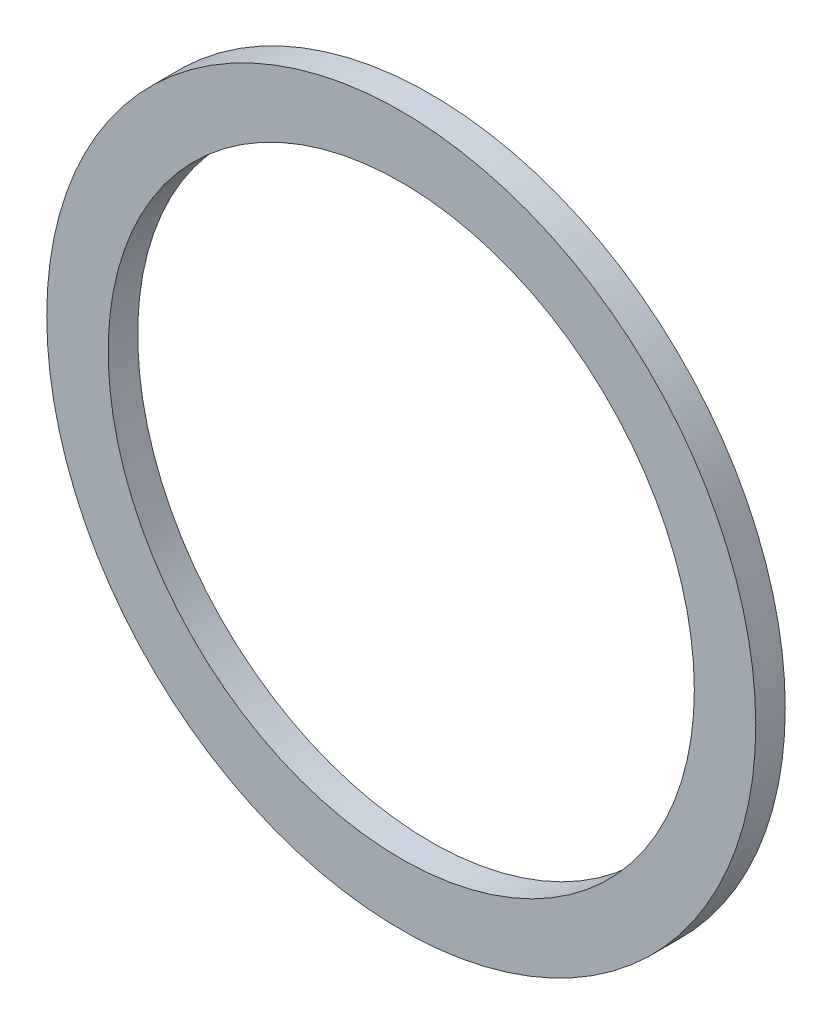
ISO-10303-21;
HEADER;
FILE_DESCRIPTION(('STEP AP214'),'2;1');
FILE_NAME('part.step','',(''),(''),'','','');
FILE_SCHEMA(('AUTOMOTIVE_DESIGN { 1 0 10303 214 1 1 1 1 }'));
ENDSEC;
DATA;
#1=APPLICATION_CONTEXT('core data for automotive mechanical design processes');
#2=APPLICATION_PROTOCOL_DEFINITION('international standard','automotive_design',2000,#1);
#3=PRODUCT_CONTEXT('',#1,'mechanical');
#4=PRODUCT('Part','Part','',(#3));
#5=PRODUCT_RELATED_PRODUCT_CATEGORY('part','',(#4));
#6=PRODUCT_DEFINITION_FORMATION('','',#4);
#7=PRODUCT_DEFINITION_CONTEXT('part definition',#1,'design');
#8=PRODUCT_DEFINITION('design','',#6,#7);
#9=PRODUCT_DEFINITION_SHAPE('','',#8);
#10=(LENGTH_UNIT() NAMED_UNIT(*) SI_UNIT(.MILLI.,.METRE.));
#11=(NAMED_UNIT(*) PLANE_ANGLE_UNIT() SI_UNIT($,.RADIAN.));
#12=(NAMED_UNIT(*) SI_UNIT($,.STERADIAN.) SOLID_ANGLE_UNIT());
#13=UNCERTAINTY_MEASURE_WITH_UNIT(LENGTH_MEASURE(1.E-05),#10,'distance_accuracy_value','');
#14=(GEOMETRIC_REPRESENTATION_CONTEXT(3) GLOBAL_UNCERTAINTY_ASSIGNED_CONTEXT((#13)) GLOBAL_UNIT_ASSIGNED_CONTEXT((#10,
#11,#12)) REPRESENTATION_CONTEXT('',''));
#15=CARTESIAN_POINT('',(0.,0.,0.));
#16=DIRECTION('',(0.,0.,1.));
#17=DIRECTION('',(1.,0.,0.));
#18=AXIS2_PLACEMENT_3D('',#15,#16,#17);
#19=CARTESIAN_POINT('',(0.,0.,3.048));
#20=DIRECTION('',(0.,0.,1.));
#21=DIRECTION('',(1.,0.,0.));
#22=AXIS2_PLACEMENT_3D('',#19,#20,#21);
#23=CYLINDRICAL_SURFACE('',#22,36.6395);
#24=CARTESIAN_POINT('',(0.,0.,3.048));
#25=DIRECTION('',(0.,0.,1.));
#26=DIRECTION('',(1.,0.,0.));
#27=AXIS2_PLACEMENT_3D('',#24,#25,#26);
#28=CIRCLE('',#27,36.6395);
#29=CARTESIAN_POINT('',(36.6395,0.,3.048));
#30=VERTEX_POINT('',#29);
#31=EDGE_CURVE('E60',#30,#30,#28,.T.);
#32=ORIENTED_EDGE('',*,*,#31,.F.);
#33=EDGE_LOOP('',(#32));
#34=FACE_BOUND('',#33,.T.);
#35=CARTESIAN_POINT('',(0.,0.,0.));
#36=DIRECTION('',(0.,0.,1.));
#37=DIRECTION('',(1.,0.,0.));
#38=AXIS2_PLACEMENT_3D('',#35,#36,#37);
#39=CIRCLE('',#38,36.6395);
#40=CARTESIAN_POINT('',(36.6395,0.,0.));
#41=VERTEX_POINT('',#40);
#42=EDGE_CURVE('E68',#41,#41,#39,.T.);
#43=ORIENTED_EDGE('',*,*,#42,.T.);
#44=EDGE_LOOP('',(#43));
#45=FACE_BOUND('',#44,.T.);
#46=ADVANCED_FACE('F51',(#34,#45),#23,.T.);
#47=CARTESIAN_POINT('',(0.,0.,3.048));
#48=DIRECTION('',(0.,0.,1.));
#49=DIRECTION('',(1.,0.,0.));
#50=AXIS2_PLACEMENT_3D('',#47,#48,#49);
#51=CYLINDRICAL_SURFACE('',#50,30.2895);
#52=CARTESIAN_POINT('',(0.,0.,3.048));
#53=DIRECTION('',(0.,0.,1.));
#54=DIRECTION('',(1.,0.,0.));
#55=AXIS2_PLACEMENT_3D('',#52,#53,#54);
#56=CIRCLE('',#55,30.2895);
#57=CARTESIAN_POINT('',(30.2895,0.,3.048));
#58=VERTEX_POINT('',#57);
#59=EDGE_CURVE('E11',#58,#58,#56,.T.);
#60=ORIENTED_EDGE('',*,*,#59,.T.);
#61=EDGE_LOOP('',(#60));
#62=FACE_BOUND('',#61,.T.);
#63=CARTESIAN_POINT('',(0.,0.,0.));
#64=DIRECTION('',(0.,0.,1.));
#65=DIRECTION('',(1.,0.,0.));
#66=AXIS2_PLACEMENT_3D('',#63,#64,#65);
#67=CIRCLE('',#66,30.2895);
#68=CARTESIAN_POINT('',(30.2895,0.,0.));
#69=VERTEX_POINT('',#68);
#70=EDGE_CURVE('E55',#69,#69,#67,.T.);
#71=ORIENTED_EDGE('',*,*,#70,.F.);
#72=EDGE_LOOP('',(#71));
#73=FACE_BOUND('',#72,.T.);
#74=ADVANCED_FACE('F53',(#62,#73),#51,.F.);
#75=CARTESIAN_POINT('',(0.,0.,3.048));
#76=DIRECTION('',(0.,0.,1.));
#77=DIRECTION('',(1.,0.,0.));
#78=AXIS2_PLACEMENT_3D('',#75,#76,#77);
#79=PLANE('',#78);
#80=ORIENTED_EDGE('',*,*,#31,.T.);
#81=EDGE_LOOP('',(#80));
#82=FACE_BOUND('',#81,.T.);
#83=ORIENTED_EDGE('',*,*,#59,.F.);
#84=EDGE_LOOP('',(#83));
#85=FACE_BOUND('',#84,.T.);
#86=ADVANCED_FACE('F82',(#82,#85),#79,.T.);
#87=CARTESIAN_POINT('',(0.,0.,0.));
#88=DIRECTION('',(0.,0.,1.));
#89=DIRECTION('',(1.,0.,0.));
#90=AXIS2_PLACEMENT_3D('',#87,#88,#89);
#91=PLANE('',#90);
#92=ORIENTED_EDGE('',*,*,#42,.F.);
#93=EDGE_LOOP('',(#92));
#94=FACE_BOUND('',#93,.T.);
#95=ORIENTED_EDGE('',*,*,#70,.T.);
#96=EDGE_LOOP('',(#95));
#97=FACE_BOUND('',#96,.T.);
#98=ADVANCED_FACE('F79',(#94,#97),#91,.F.);
#99=CLOSED_SHELL('',(#46,#74,#86,#98));
#100=MANIFOLD_SOLID_BREP('B2',#99);
#101=ADVANCED_BREP_SHAPE_REPRESENTATION('',(#18,#100),#14);
#102=SHAPE_DEFINITION_REPRESENTATION(#9,#101);
ENDSEC;
END-ISO-10303-21;
